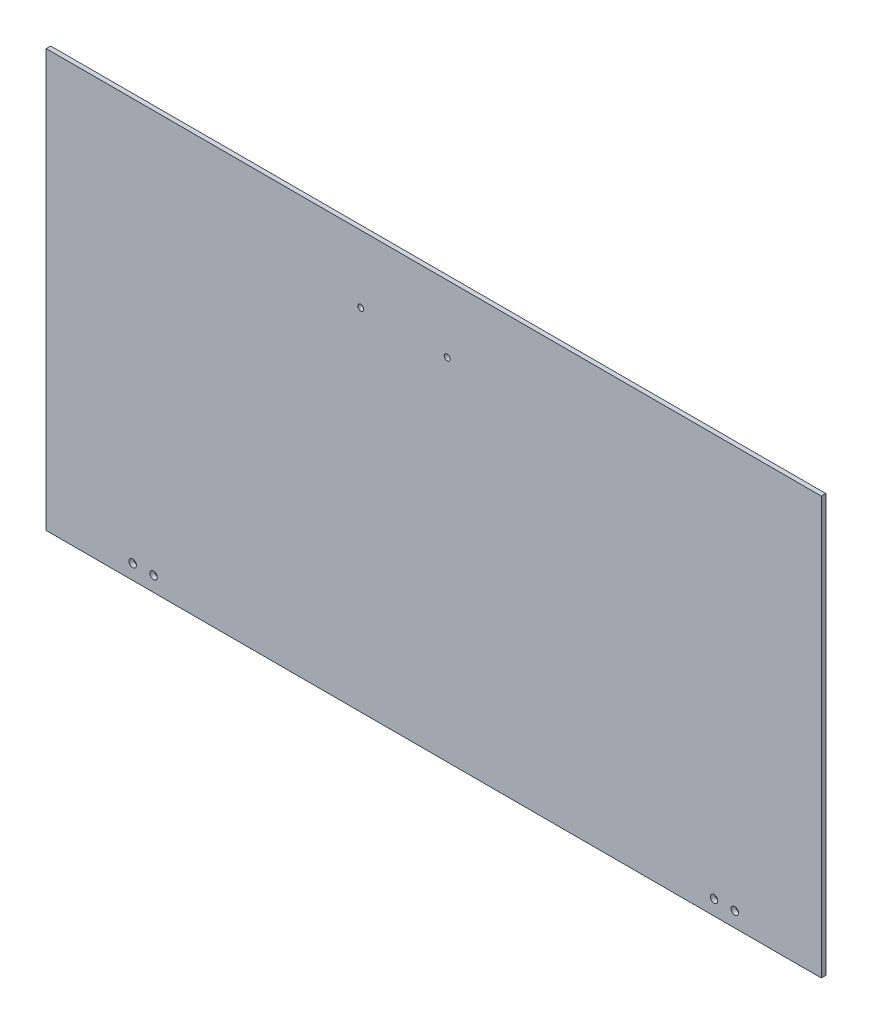
ISO-10303-21;
HEADER;
FILE_DESCRIPTION(('STEP AP214'),'2;1');
FILE_NAME('part.step','',(''),(''),'','','');
FILE_SCHEMA(('AUTOMOTIVE_DESIGN { 1 0 10303 214 1 1 1 1 }'));
ENDSEC;
DATA;
#1=APPLICATION_CONTEXT('core data for automotive mechanical design processes');
#2=APPLICATION_PROTOCOL_DEFINITION('international standard','automotive_design',2000,#1);
#3=PRODUCT_CONTEXT('',#1,'mechanical');
#4=PRODUCT('Part','Part','',(#3));
#5=PRODUCT_RELATED_PRODUCT_CATEGORY('part','',(#4));
#6=PRODUCT_DEFINITION_FORMATION('','',#4);
#7=PRODUCT_DEFINITION_CONTEXT('part definition',#1,'design');
#8=PRODUCT_DEFINITION('design','',#6,#7);
#9=PRODUCT_DEFINITION_SHAPE('','',#8);
#10=(LENGTH_UNIT() NAMED_UNIT(*) SI_UNIT(.MILLI.,.METRE.));
#11=(NAMED_UNIT(*) PLANE_ANGLE_UNIT() SI_UNIT($,.RADIAN.));
#12=(NAMED_UNIT(*) SI_UNIT($,.STERADIAN.) SOLID_ANGLE_UNIT());
#13=UNCERTAINTY_MEASURE_WITH_UNIT(LENGTH_MEASURE(1.E-05),#10,'distance_accuracy_value','');
#14=(GEOMETRIC_REPRESENTATION_CONTEXT(3) GLOBAL_UNCERTAINTY_ASSIGNED_CONTEXT((#13)) GLOBAL_UNIT_ASSIGNED_CONTEXT((#10,
#11,#12)) REPRESENTATION_CONTEXT('',''));
#15=CARTESIAN_POINT('',(0.,0.,0.));
#16=DIRECTION('',(0.,0.,1.));
#17=DIRECTION('',(1.,0.,0.));
#18=AXIS2_PLACEMENT_3D('',#15,#16,#17);
#19=CARTESIAN_POINT('',(0.,0.,3.));
#20=DIRECTION('',(0.,0.,-1.));
#21=DIRECTION('',(-1.,0.,0.));
#22=AXIS2_PLACEMENT_3D('',#19,#20,#21);
#23=PLANE('',#22);
#24=CARTESIAN_POINT('',(269.,235.000000000004,3.));
#25=DIRECTION('',(0.,0.,-1.));
#26=DIRECTION('',(-1.,0.,0.));
#27=AXIS2_PLACEMENT_3D('',#24,#25,#26);
#28=CIRCLE('',#27,2.);
#29=CARTESIAN_POINT('',(267.,235.000000000004,3.));
#30=VERTEX_POINT('',#29);
#31=EDGE_CURVE('E142',#30,#30,#28,.T.);
#32=ORIENTED_EDGE('',*,*,#31,.T.);
#33=EDGE_LOOP('',(#32));
#34=FACE_BOUND('',#33,.T.);
#35=CARTESIAN_POINT('',(211.,235.000000000004,3.));
#36=DIRECTION('',(0.,0.,-1.));
#37=DIRECTION('',(-1.,0.,0.));
#38=AXIS2_PLACEMENT_3D('',#35,#36,#37);
#39=CIRCLE('',#38,2.);
#40=CARTESIAN_POINT('',(209.,235.000000000004,3.));
#41=VERTEX_POINT('',#40);
#42=EDGE_CURVE('E136',#41,#41,#39,.T.);
#43=ORIENTED_EDGE('',*,*,#42,.T.);
#44=EDGE_LOOP('',(#43));
#45=FACE_BOUND('',#44,.T.);
#46=CARTESIAN_POINT('',(461.999997675314,10.000001609367,3.));
#47=DIRECTION('',(0.,0.,1.));
#48=DIRECTION('',(1.,0.,0.));
#49=AXIS2_PLACEMENT_3D('',#46,#47,#48);
#50=CIRCLE('',#49,2.5);
#51=CARTESIAN_POINT('',(464.499997675314,10.000001609367,3.));
#52=VERTEX_POINT('',#51);
#53=EDGE_CURVE('E133',#52,#52,#50,.T.);
#54=ORIENTED_EDGE('',*,*,#53,.F.);
#55=EDGE_LOOP('',(#54));
#56=FACE_BOUND('',#55,.T.);
#57=CARTESIAN_POINT('',(447.999997675314,10.0000016092986,3.));
#58=DIRECTION('',(0.,0.,1.));
#59=DIRECTION('',(1.,0.,0.));
#60=AXIS2_PLACEMENT_3D('',#57,#58,#59);
#61=CIRCLE('',#60,2.5);
#62=CARTESIAN_POINT('',(450.499997675314,10.0000016092986,3.));
#63=VERTEX_POINT('',#62);
#64=EDGE_CURVE('E127',#63,#63,#61,.T.);
#65=ORIENTED_EDGE('',*,*,#64,.F.);
#66=EDGE_LOOP('',(#65));
#67=FACE_BOUND('',#66,.T.);
#68=CARTESIAN_POINT('',(71.9999976753009,10.0000016092737,3.));
#69=DIRECTION('',(0.,0.,1.));
#70=DIRECTION('',(1.,0.,0.));
#71=AXIS2_PLACEMENT_3D('',#68,#69,#70);
#72=CIRCLE('',#71,2.5);
#73=CARTESIAN_POINT('',(74.4999976753009,10.0000016092737,3.));
#74=VERTEX_POINT('',#73);
#75=EDGE_CURVE('E121',#74,#74,#72,.T.);
#76=ORIENTED_EDGE('',*,*,#75,.F.);
#77=EDGE_LOOP('',(#76));
#78=FACE_BOUND('',#77,.T.);
#79=DIRECTION('',(0.,-1.,0.));
#80=VECTOR('',#79,1.);
#81=CARTESIAN_POINT('',(0.,0.,3.));
#82=LINE('',#81,#80);
#83=CARTESIAN_POINT('',(0.,280.,3.));
#84=VERTEX_POINT('',#83);
#85=CARTESIAN_POINT('',(0.,0.,3.));
#86=VERTEX_POINT('',#85);
#87=EDGE_CURVE('E87',#84,#86,#82,.T.);
#88=ORIENTED_EDGE('',*,*,#87,.T.);
#89=DIRECTION('',(1.,0.,0.));
#90=VECTOR('',#89,1.);
#91=CARTESIAN_POINT('',(0.,0.,3.));
#92=LINE('',#91,#90);
#93=CARTESIAN_POINT('',(520.,0.,3.));
#94=VERTEX_POINT('',#93);
#95=EDGE_CURVE('E82',#86,#94,#92,.T.);
#96=ORIENTED_EDGE('',*,*,#95,.T.);
#97=DIRECTION('',(0.,1.,0.));
#98=VECTOR('',#97,1.);
#99=CARTESIAN_POINT('',(520.,0.,3.));
#100=LINE('',#99,#98);
#101=CARTESIAN_POINT('',(520.,280.,3.));
#102=VERTEX_POINT('',#101);
#103=EDGE_CURVE('E85',#94,#102,#100,.T.);
#104=ORIENTED_EDGE('',*,*,#103,.T.);
#105=DIRECTION('',(-1.,0.,0.));
#106=VECTOR('',#105,1.);
#107=CARTESIAN_POINT('',(0.,280.,3.));
#108=LINE('',#107,#106);
#109=EDGE_CURVE('E52',#102,#84,#108,.T.);
#110=ORIENTED_EDGE('',*,*,#109,.T.);
#111=EDGE_LOOP('',(#88,#96,#104,#110));
#112=FACE_BOUND('',#111,.T.);
#113=CARTESIAN_POINT('',(57.9999976753009,10.0000016092764,3.));
#114=DIRECTION('',(0.,0.,1.));
#115=DIRECTION('',(1.,0.,0.));
#116=AXIS2_PLACEMENT_3D('',#113,#114,#115);
#117=CIRCLE('',#116,2.5);
#118=CARTESIAN_POINT('',(60.4999976753009,10.0000016092764,3.));
#119=VERTEX_POINT('',#118);
#120=EDGE_CURVE('E115',#119,#119,#117,.T.);
#121=ORIENTED_EDGE('',*,*,#120,.F.);
#122=EDGE_LOOP('',(#121));
#123=FACE_BOUND('',#122,.T.);
#124=ADVANCED_FACE('F35',(#34,#45,#56,#67,#78,#112,#123),#23,.F.);
#125=CARTESIAN_POINT('',(0.,0.,3.));
#126=DIRECTION('',(1.,0.,0.));
#127=DIRECTION('',(0.,0.,-1.));
#128=AXIS2_PLACEMENT_3D('',#125,#126,#127);
#129=PLANE('',#128);
#130=DIRECTION('',(0.,-1.,0.));
#131=VECTOR('',#130,1.);
#132=CARTESIAN_POINT('',(0.,0.,0.));
#133=LINE('',#132,#131);
#134=CARTESIAN_POINT('',(0.,280.,0.));
#135=VERTEX_POINT('',#134);
#136=CARTESIAN_POINT('',(0.,0.,0.));
#137=VERTEX_POINT('',#136);
#138=EDGE_CURVE('E99',#135,#137,#133,.T.);
#139=ORIENTED_EDGE('',*,*,#138,.T.);
#140=DIRECTION('',(0.,0.,-1.));
#141=VECTOR('',#140,1.);
#142=CARTESIAN_POINT('',(0.,0.,3.));
#143=LINE('',#142,#141);
#144=EDGE_CURVE('E11',#86,#137,#143,.T.);
#145=ORIENTED_EDGE('',*,*,#144,.F.);
#146=ORIENTED_EDGE('',*,*,#87,.F.);
#147=DIRECTION('',(0.,0.,-1.));
#148=VECTOR('',#147,1.);
#149=CARTESIAN_POINT('',(0.,280.,3.));
#150=LINE('',#149,#148);
#151=EDGE_CURVE('E95',#84,#135,#150,.T.);
#152=ORIENTED_EDGE('',*,*,#151,.T.);
#153=EDGE_LOOP('',(#139,#145,#146,#152));
#154=FACE_BOUND('',#153,.T.);
#155=ADVANCED_FACE('F37',(#154),#129,.F.);
#156=CARTESIAN_POINT('',(0.,0.,3.));
#157=DIRECTION('',(0.,1.,0.));
#158=DIRECTION('',(0.,0.,1.));
#159=AXIS2_PLACEMENT_3D('',#156,#157,#158);
#160=PLANE('',#159);
#161=DIRECTION('',(1.,0.,0.));
#162=VECTOR('',#161,1.);
#163=CARTESIAN_POINT('',(0.,0.,0.));
#164=LINE('',#163,#162);
#165=CARTESIAN_POINT('',(520.,0.,0.));
#166=VERTEX_POINT('',#165);
#167=EDGE_CURVE('E91',#137,#166,#164,.T.);
#168=ORIENTED_EDGE('',*,*,#167,.T.);
#169=DIRECTION('',(0.,0.,-1.));
#170=VECTOR('',#169,1.);
#171=CARTESIAN_POINT('',(520.,0.,3.));
#172=LINE('',#171,#170);
#173=EDGE_CURVE('E44',#94,#166,#172,.T.);
#174=ORIENTED_EDGE('',*,*,#173,.F.);
#175=ORIENTED_EDGE('',*,*,#95,.F.);
#176=ORIENTED_EDGE('',*,*,#144,.T.);
#177=EDGE_LOOP('',(#168,#174,#175,#176));
#178=FACE_BOUND('',#177,.T.);
#179=ADVANCED_FACE('F90',(#178),#160,.F.);
#180=CARTESIAN_POINT('',(520.,0.,3.));
#181=DIRECTION('',(-1.,0.,0.));
#182=DIRECTION('',(0.,0.,1.));
#183=AXIS2_PLACEMENT_3D('',#180,#181,#182);
#184=PLANE('',#183);
#185=DIRECTION('',(0.,1.,0.));
#186=VECTOR('',#185,1.);
#187=CARTESIAN_POINT('',(520.,0.,0.));
#188=LINE('',#187,#186);
#189=CARTESIAN_POINT('',(520.,280.,0.));
#190=VERTEX_POINT('',#189);
#191=EDGE_CURVE('E69',#166,#190,#188,.T.);
#192=ORIENTED_EDGE('',*,*,#191,.T.);
#193=DIRECTION('',(0.,0.,-1.));
#194=VECTOR('',#193,1.);
#195=CARTESIAN_POINT('',(520.,280.,3.));
#196=LINE('',#195,#194);
#197=EDGE_CURVE('E92',#102,#190,#196,.T.);
#198=ORIENTED_EDGE('',*,*,#197,.F.);
#199=ORIENTED_EDGE('',*,*,#103,.F.);
#200=ORIENTED_EDGE('',*,*,#173,.T.);
#201=EDGE_LOOP('',(#192,#198,#199,#200));
#202=FACE_BOUND('',#201,.T.);
#203=ADVANCED_FACE('F93',(#202),#184,.F.);
#204=CARTESIAN_POINT('',(0.,280.,3.));
#205=DIRECTION('',(0.,-1.,0.));
#206=DIRECTION('',(0.,0.,-1.));
#207=AXIS2_PLACEMENT_3D('',#204,#205,#206);
#208=PLANE('',#207);
#209=DIRECTION('',(-1.,0.,0.));
#210=VECTOR('',#209,1.);
#211=CARTESIAN_POINT('',(0.,280.,0.));
#212=LINE('',#211,#210);
#213=EDGE_CURVE('E75',#190,#135,#212,.T.);
#214=ORIENTED_EDGE('',*,*,#213,.T.);
#215=ORIENTED_EDGE('',*,*,#151,.F.);
#216=ORIENTED_EDGE('',*,*,#109,.F.);
#217=ORIENTED_EDGE('',*,*,#197,.T.);
#218=EDGE_LOOP('',(#214,#215,#216,#217));
#219=FACE_BOUND('',#218,.T.);
#220=ADVANCED_FACE('F107',(#219),#208,.F.);
#221=CARTESIAN_POINT('',(0.,0.,0.));
#222=DIRECTION('',(0.,0.,-1.));
#223=DIRECTION('',(-1.,0.,0.));
#224=AXIS2_PLACEMENT_3D('',#221,#222,#223);
#225=PLANE('',#224);
#226=CARTESIAN_POINT('',(269.,235.000000000004,0.));
#227=DIRECTION('',(0.,0.,-1.));
#228=DIRECTION('',(-1.,0.,0.));
#229=AXIS2_PLACEMENT_3D('',#226,#227,#228);
#230=CIRCLE('',#229,2.);
#231=CARTESIAN_POINT('',(267.,235.000000000004,0.));
#232=VERTEX_POINT('',#231);
#233=EDGE_CURVE('E145',#232,#232,#230,.T.);
#234=ORIENTED_EDGE('',*,*,#233,.F.);
#235=EDGE_LOOP('',(#234));
#236=FACE_BOUND('',#235,.T.);
#237=CARTESIAN_POINT('',(211.,235.000000000004,0.));
#238=DIRECTION('',(0.,0.,-1.));
#239=DIRECTION('',(-1.,0.,0.));
#240=AXIS2_PLACEMENT_3D('',#237,#238,#239);
#241=CIRCLE('',#240,2.);
#242=CARTESIAN_POINT('',(209.,235.000000000004,0.));
#243=VERTEX_POINT('',#242);
#244=EDGE_CURVE('E139',#243,#243,#241,.T.);
#245=ORIENTED_EDGE('',*,*,#244,.F.);
#246=EDGE_LOOP('',(#245));
#247=FACE_BOUND('',#246,.T.);
#248=CARTESIAN_POINT('',(461.999997675314,10.000001609367,0.));
#249=DIRECTION('',(0.,0.,-1.));
#250=DIRECTION('',(-1.,0.,0.));
#251=AXIS2_PLACEMENT_3D('',#248,#249,#250);
#252=CIRCLE('',#251,2.5);
#253=CARTESIAN_POINT('',(459.499997675314,10.000001609367,0.));
#254=VERTEX_POINT('',#253);
#255=EDGE_CURVE('E130',#254,#254,#252,.T.);
#256=ORIENTED_EDGE('',*,*,#255,.F.);
#257=EDGE_LOOP('',(#256));
#258=FACE_BOUND('',#257,.T.);
#259=CARTESIAN_POINT('',(447.999997675314,10.0000016092986,0.));
#260=DIRECTION('',(0.,0.,-1.));
#261=DIRECTION('',(-1.,0.,0.));
#262=AXIS2_PLACEMENT_3D('',#259,#260,#261);
#263=CIRCLE('',#262,2.5);
#264=CARTESIAN_POINT('',(445.499997675314,10.0000016092986,0.));
#265=VERTEX_POINT('',#264);
#266=EDGE_CURVE('E124',#265,#265,#263,.T.);
#267=ORIENTED_EDGE('',*,*,#266,.F.);
#268=EDGE_LOOP('',(#267));
#269=FACE_BOUND('',#268,.T.);
#270=CARTESIAN_POINT('',(71.9999976753009,10.0000016092737,0.));
#271=DIRECTION('',(0.,0.,-1.));
#272=DIRECTION('',(-1.,0.,0.));
#273=AXIS2_PLACEMENT_3D('',#270,#271,#272);
#274=CIRCLE('',#273,2.5);
#275=CARTESIAN_POINT('',(69.4999976753009,10.0000016092737,0.));
#276=VERTEX_POINT('',#275);
#277=EDGE_CURVE('E118',#276,#276,#274,.T.);
#278=ORIENTED_EDGE('',*,*,#277,.F.);
#279=EDGE_LOOP('',(#278));
#280=FACE_BOUND('',#279,.T.);
#281=CARTESIAN_POINT('',(57.9999976753009,10.0000016092764,0.));
#282=DIRECTION('',(0.,0.,-1.));
#283=DIRECTION('',(-1.,0.,0.));
#284=AXIS2_PLACEMENT_3D('',#281,#282,#283);
#285=CIRCLE('',#284,2.5);
#286=CARTESIAN_POINT('',(55.4999976753009,10.0000016092764,0.));
#287=VERTEX_POINT('',#286);
#288=EDGE_CURVE('E102',#287,#287,#285,.T.);
#289=ORIENTED_EDGE('',*,*,#288,.F.);
#290=EDGE_LOOP('',(#289));
#291=FACE_BOUND('',#290,.T.);
#292=ORIENTED_EDGE('',*,*,#138,.F.);
#293=ORIENTED_EDGE('',*,*,#213,.F.);
#294=ORIENTED_EDGE('',*,*,#191,.F.);
#295=ORIENTED_EDGE('',*,*,#167,.F.);
#296=EDGE_LOOP('',(#292,#293,#294,#295));
#297=FACE_BOUND('',#296,.T.);
#298=ADVANCED_FACE('F110',(#236,#247,#258,#269,#280,#291,#297),#225,.T.);
#299=CARTESIAN_POINT('',(57.9999976753009,10.0000016092764,3.));
#300=DIRECTION('',(0.,0.,1.));
#301=DIRECTION('',(1.,0.,0.));
#302=AXIS2_PLACEMENT_3D('',#299,#300,#301);
#303=CYLINDRICAL_SURFACE('',#302,2.5);
#304=ORIENTED_EDGE('',*,*,#120,.T.);
#305=EDGE_LOOP('',(#304));
#306=FACE_BOUND('',#305,.T.);
#307=ORIENTED_EDGE('',*,*,#288,.T.);
#308=EDGE_LOOP('',(#307));
#309=FACE_BOUND('',#308,.T.);
#310=ADVANCED_FACE('F153',(#306,#309),#303,.F.);
#311=CARTESIAN_POINT('',(71.9999976753009,10.0000016092737,3.));
#312=DIRECTION('',(0.,0.,1.));
#313=DIRECTION('',(1.,0.,0.));
#314=AXIS2_PLACEMENT_3D('',#311,#312,#313);
#315=CYLINDRICAL_SURFACE('',#314,2.5);
#316=ORIENTED_EDGE('',*,*,#75,.T.);
#317=EDGE_LOOP('',(#316));
#318=FACE_BOUND('',#317,.T.);
#319=ORIENTED_EDGE('',*,*,#277,.T.);
#320=EDGE_LOOP('',(#319));
#321=FACE_BOUND('',#320,.T.);
#322=ADVANCED_FACE('F166',(#318,#321),#315,.F.);
#323=CARTESIAN_POINT('',(447.999997675314,10.0000016092986,3.));
#324=DIRECTION('',(0.,0.,1.));
#325=DIRECTION('',(1.,0.,0.));
#326=AXIS2_PLACEMENT_3D('',#323,#324,#325);
#327=CYLINDRICAL_SURFACE('',#326,2.5);
#328=ORIENTED_EDGE('',*,*,#64,.T.);
#329=EDGE_LOOP('',(#328));
#330=FACE_BOUND('',#329,.T.);
#331=ORIENTED_EDGE('',*,*,#266,.T.);
#332=EDGE_LOOP('',(#331));
#333=FACE_BOUND('',#332,.T.);
#334=ADVANCED_FACE('F172',(#330,#333),#327,.F.);
#335=CARTESIAN_POINT('',(461.999997675314,10.000001609367,3.));
#336=DIRECTION('',(0.,0.,1.));
#337=DIRECTION('',(1.,0.,0.));
#338=AXIS2_PLACEMENT_3D('',#335,#336,#337);
#339=CYLINDRICAL_SURFACE('',#338,2.5);
#340=ORIENTED_EDGE('',*,*,#53,.T.);
#341=EDGE_LOOP('',(#340));
#342=FACE_BOUND('',#341,.T.);
#343=ORIENTED_EDGE('',*,*,#255,.T.);
#344=EDGE_LOOP('',(#343));
#345=FACE_BOUND('',#344,.T.);
#346=ADVANCED_FACE('F216',(#342,#345),#339,.F.);
#347=CARTESIAN_POINT('',(211.,235.000000000004,0.));
#348=DIRECTION('',(0.,0.,-1.));
#349=DIRECTION('',(-1.,0.,0.));
#350=AXIS2_PLACEMENT_3D('',#347,#348,#349);
#351=CYLINDRICAL_SURFACE('',#350,2.);
#352=ORIENTED_EDGE('',*,*,#42,.F.);
#353=EDGE_LOOP('',(#352));
#354=FACE_BOUND('',#353,.T.);
#355=ORIENTED_EDGE('',*,*,#244,.T.);
#356=EDGE_LOOP('',(#355));
#357=FACE_BOUND('',#356,.T.);
#358=ADVANCED_FACE('F211',(#354,#357),#351,.F.);
#359=CARTESIAN_POINT('',(269.,235.000000000004,0.));
#360=DIRECTION('',(0.,0.,-1.));
#361=DIRECTION('',(-1.,0.,0.));
#362=AXIS2_PLACEMENT_3D('',#359,#360,#361);
#363=CYLINDRICAL_SURFACE('',#362,2.);
#364=ORIENTED_EDGE('',*,*,#31,.F.);
#365=EDGE_LOOP('',(#364));
#366=FACE_BOUND('',#365,.T.);
#367=ORIENTED_EDGE('',*,*,#233,.T.);
#368=EDGE_LOOP('',(#367));
#369=FACE_BOUND('',#368,.T.);
#370=ADVANCED_FACE('F149',(#366,#369),#363,.F.);
#371=CLOSED_SHELL('',(#124,#155,#179,#203,#220,#298,#310,#322,#334,#346,#358,#370));
#372=MANIFOLD_SOLID_BREP('B2',#371);
#373=ADVANCED_BREP_SHAPE_REPRESENTATION('',(#18,#372),#14);
#374=SHAPE_DEFINITION_REPRESENTATION(#9,#373);
ENDSEC;
END-ISO-10303-21;
